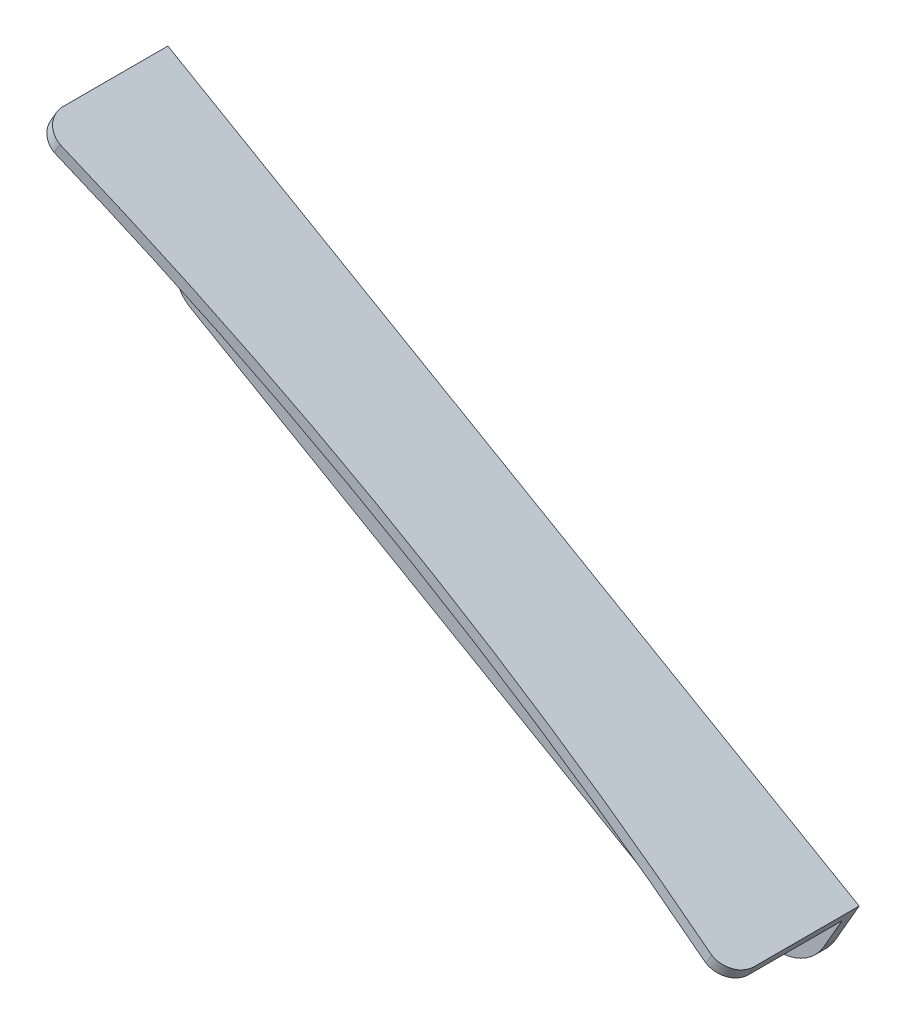
ISO-10303-21;
HEADER;
FILE_DESCRIPTION(('STEP AP214'),'2;1');
FILE_NAME('part.step','',(''),(''),'','','');
FILE_SCHEMA(('AUTOMOTIVE_DESIGN { 1 0 10303 214 1 1 1 1 }'));
ENDSEC;
DATA;
#1=APPLICATION_CONTEXT('core data for automotive mechanical design processes');
#2=APPLICATION_PROTOCOL_DEFINITION('international standard','automotive_design',2000,#1);
#3=PRODUCT_CONTEXT('',#1,'mechanical');
#4=PRODUCT('Part','Part','',(#3));
#5=PRODUCT_RELATED_PRODUCT_CATEGORY('part','',(#4));
#6=PRODUCT_DEFINITION_FORMATION('','',#4);
#7=PRODUCT_DEFINITION_CONTEXT('part definition',#1,'design');
#8=PRODUCT_DEFINITION('design','',#6,#7);
#9=PRODUCT_DEFINITION_SHAPE('','',#8);
#10=(LENGTH_UNIT() NAMED_UNIT(*) SI_UNIT(.MILLI.,.METRE.));
#11=(NAMED_UNIT(*) PLANE_ANGLE_UNIT() SI_UNIT($,.RADIAN.));
#12=(NAMED_UNIT(*) SI_UNIT($,.STERADIAN.) SOLID_ANGLE_UNIT());
#13=UNCERTAINTY_MEASURE_WITH_UNIT(LENGTH_MEASURE(1.E-05),#10,'distance_accuracy_value','');
#14=(GEOMETRIC_REPRESENTATION_CONTEXT(3) GLOBAL_UNCERTAINTY_ASSIGNED_CONTEXT((#13)) GLOBAL_UNIT_ASSIGNED_CONTEXT((#10,
#11,#12)) REPRESENTATION_CONTEXT('',''));
#15=CARTESIAN_POINT('',(0.,0.,0.));
#16=DIRECTION('',(0.,0.,1.));
#17=DIRECTION('',(1.,0.,0.));
#18=AXIS2_PLACEMENT_3D('',#15,#16,#17);
#19=CARTESIAN_POINT('',(19.620752939166,-11.3283792951308,14.224));
#20=DIRECTION('',(0.866019052628733,-0.500011000363024,0.));
#21=DIRECTION('',(0.500011000363024,0.866019052628733,0.));
#22=AXIS2_PLACEMENT_3D('',#19,#20,#21);
#23=PLANE('',#22);
#24=DIRECTION('',(0.,0.,-1.));
#25=VECTOR('',#24,1.);
#26=CARTESIAN_POINT('',(29.5130283607604,5.80504173507003,14.224));
#27=LINE('',#26,#25);
#28=CARTESIAN_POINT('',(29.5130283607604,5.80504173507003,1.27));
#29=VERTEX_POINT('',#28);
#30=CARTESIAN_POINT('',(29.5130283607604,5.80504173507003,0.));
#31=VERTEX_POINT('',#30);
#32=EDGE_CURVE('E28',#29,#31,#27,.T.);
#33=ORIENTED_EDGE('',*,*,#32,.F.);
#34=DIRECTION('',(0.500011000363024,0.866019052628733,0.));
#35=VECTOR('',#34,1.);
#36=CARTESIAN_POINT('',(19.620752939166,-11.3283792951308,1.27));
#37=LINE('',#36,#35);
#38=CARTESIAN_POINT('',(30.5070787253845,7.52673696659909,1.27));
#39=VERTEX_POINT('',#38);
#40=EDGE_CURVE('E316',#29,#39,#37,.T.);
#41=ORIENTED_EDGE('',*,*,#40,.T.);
#42=DIRECTION('',(0.,0.,-1.));
#43=VECTOR('',#42,1.);
#44=CARTESIAN_POINT('',(30.5070787253845,7.52673696659909,14.224));
#45=LINE('',#44,#43);
#46=CARTESIAN_POINT('',(30.5070787253845,7.52673696659909,0.));
#47=VERTEX_POINT('',#46);
#48=EDGE_CURVE('E44',#39,#47,#45,.T.);
#49=ORIENTED_EDGE('',*,*,#48,.T.);
#50=DIRECTION('',(-0.500011000363024,-0.866019052628733,0.));
#51=VECTOR('',#50,1.);
#52=CARTESIAN_POINT('',(19.620752939166,-11.3283792951308,0.));
#53=LINE('',#52,#51);
#54=EDGE_CURVE('E203',#47,#31,#53,.T.);
#55=ORIENTED_EDGE('',*,*,#54,.T.);
#56=EDGE_LOOP('',(#33,#41,#49,#55));
#57=FACE_BOUND('',#56,.T.);
#58=ADVANCED_FACE('F17',(#57),#23,.F.);
#59=CARTESIAN_POINT('',(32.2626388528566,4.21750680891743,14.224));
#60=DIRECTION('',(0.,0.,-1.));
#61=DIRECTION('',(-1.,0.,0.));
#62=AXIS2_PLACEMENT_3D('',#59,#60,#61);
#63=CYLINDRICAL_SURFACE('',#62,3.175);
#64=DIRECTION('',(0.,0.,-1.));
#65=VECTOR('',#64,1.);
#66=CARTESIAN_POINT('',(30.675103926704,1.46789631682121,14.224));
#67=LINE('',#66,#65);
#68=CARTESIAN_POINT('',(30.675103926704,1.4678963168212,1.27));
#69=VERTEX_POINT('',#68);
#70=CARTESIAN_POINT('',(30.675103926704,1.46789631682121,0.));
#71=VERTEX_POINT('',#70);
#72=EDGE_CURVE('E265',#69,#71,#67,.T.);
#73=ORIENTED_EDGE('',*,*,#72,.F.);
#74=CARTESIAN_POINT('',(32.2626388528566,4.21750680891743,1.27));
#75=DIRECTION('',(0.,0.,-1.));
#76=DIRECTION('',(0.,1.,0.));
#77=AXIS2_PLACEMENT_3D('',#74,#75,#76);
#78=CIRCLE('',#77,3.175);
#79=EDGE_CURVE('E321',#69,#29,#78,.T.);
#80=ORIENTED_EDGE('',*,*,#79,.T.);
#81=ORIENTED_EDGE('',*,*,#32,.T.);
#82=CARTESIAN_POINT('',(32.2626388528566,4.21750680891743,0.));
#83=DIRECTION('',(0.,0.,1.));
#84=DIRECTION('',(1.,0.,0.));
#85=AXIS2_PLACEMENT_3D('',#82,#83,#84);
#86=CIRCLE('',#85,3.175);
#87=EDGE_CURVE('E205',#31,#71,#86,.T.);
#88=ORIENTED_EDGE('',*,*,#87,.T.);
#89=EDGE_LOOP('',(#73,#80,#81,#88));
#90=FACE_BOUND('',#89,.T.);
#91=ADVANCED_FACE('F306',(#90),#63,.T.);
#92=CARTESIAN_POINT('',(8.3047404954416,14.3838105381046,14.224));
#93=DIRECTION('',(0.50001100036302,0.866019052628735,0.));
#94=DIRECTION('',(-0.866019052628735,0.50001100036302,0.));
#95=AXIS2_PLACEMENT_3D('',#92,#93,#94);
#96=PLANE('',#95);
#97=DIRECTION('',(0.,0.,-1.));
#98=VECTOR('',#97,1.);
#99=CARTESIAN_POINT('',(82.3672488476662,-28.3774529447048,14.224));
#100=LINE('',#99,#98);
#101=CARTESIAN_POINT('',(82.3672488476662,-28.3774529447048,1.27));
#102=VERTEX_POINT('',#101);
#103=CARTESIAN_POINT('',(82.3672488476662,-28.3774529447048,0.));
#104=VERTEX_POINT('',#103);
#105=EDGE_CURVE('E263',#102,#104,#100,.T.);
#106=ORIENTED_EDGE('',*,*,#105,.F.);
#107=DIRECTION('',(-0.866019052628735,0.50001100036302,0.));
#108=VECTOR('',#107,1.);
#109=CARTESIAN_POINT('',(8.3047404954416,14.3838105381046,1.27));
#110=LINE('',#109,#108);
#111=EDGE_CURVE('E328',#102,#69,#110,.T.);
#112=ORIENTED_EDGE('',*,*,#111,.T.);
#113=ORIENTED_EDGE('',*,*,#72,.T.);
#114=DIRECTION('',(0.866019052628735,-0.50001100036302,0.));
#115=VECTOR('',#114,1.);
#116=CARTESIAN_POINT('',(8.3047404954416,14.3838105381046,0.));
#117=LINE('',#116,#115);
#118=EDGE_CURVE('E208',#71,#104,#117,.T.);
#119=ORIENTED_EDGE('',*,*,#118,.T.);
#120=EDGE_LOOP('',(#106,#112,#113,#119));
#121=FACE_BOUND('',#120,.T.);
#122=ADVANCED_FACE('F302',(#121),#96,.F.);
#123=CARTESIAN_POINT('',(83.9547837738187,-25.6278424526086,14.224));
#124=DIRECTION('',(0.,0.,-1.));
#125=DIRECTION('',(-1.,0.,0.));
#126=AXIS2_PLACEMENT_3D('',#123,#124,#125);
#127=CYLINDRICAL_SURFACE('',#126,3.175);
#128=CARTESIAN_POINT('',(83.9547837738187,-25.6278424526086,1.27));
#129=DIRECTION('',(0.,0.,-1.));
#130=DIRECTION('',(0.,1.,0.));
#131=AXIS2_PLACEMENT_3D('',#128,#129,#130);
#132=CIRCLE('',#131,3.175);
#133=CARTESIAN_POINT('',(86.704394265915,-27.2153773787612,1.27));
#134=VERTEX_POINT('',#133);
#135=EDGE_CURVE('E330',#102,#134,#132,.F.);
#136=ORIENTED_EDGE('',*,*,#135,.F.);
#137=ORIENTED_EDGE('',*,*,#105,.T.);
#138=CARTESIAN_POINT('',(83.9547837738187,-25.6278424526086,0.));
#139=DIRECTION('',(0.,0.,1.));
#140=DIRECTION('',(1.,0.,0.));
#141=AXIS2_PLACEMENT_3D('',#138,#139,#140);
#142=CIRCLE('',#141,3.175);
#143=CARTESIAN_POINT('',(86.704394265915,-27.2153773787612,0.));
#144=VERTEX_POINT('',#143);
#145=EDGE_CURVE('E211',#144,#104,#142,.F.);
#146=ORIENTED_EDGE('',*,*,#145,.F.);
#147=DIRECTION('',(0.,0.,-1.));
#148=VECTOR('',#147,1.);
#149=CARTESIAN_POINT('',(86.704394265915,-27.2153773787612,14.224));
#150=LINE('',#149,#148);
#151=EDGE_CURVE('E261',#134,#144,#150,.T.);
#152=ORIENTED_EDGE('',*,*,#151,.F.);
#153=EDGE_LOOP('',(#136,#137,#146,#152));
#154=FACE_BOUND('',#153,.T.);
#155=ADVANCED_FACE('F298',(#154),#127,.T.);
#156=CARTESIAN_POINT('',(76.8121188443214,-44.3487984089614,14.224));
#157=DIRECTION('',(0.86601905262874,-0.500011000363012,0.));
#158=DIRECTION('',(0.500011000363012,0.86601905262874,0.));
#159=AXIS2_PLACEMENT_3D('',#156,#157,#158);
#160=PLANE('',#159);
#161=DIRECTION('',(0.500011000363012,0.86601905262874,0.));
#162=VECTOR('',#161,1.);
#163=CARTESIAN_POINT('',(76.8121188443214,-44.3487984089614,1.27));
#164=LINE('',#163,#162);
#165=CARTESIAN_POINT('',(87.6984446305392,-25.4936821472321,1.27));
#166=VERTEX_POINT('',#165);
#167=EDGE_CURVE('E332',#134,#166,#164,.T.);
#168=ORIENTED_EDGE('',*,*,#167,.F.);
#169=ORIENTED_EDGE('',*,*,#151,.T.);
#170=DIRECTION('',(-0.500011000363012,-0.86601905262874,0.));
#171=VECTOR('',#170,1.);
#172=CARTESIAN_POINT('',(76.8121188443214,-44.3487984089614,0.));
#173=LINE('',#172,#171);
#174=CARTESIAN_POINT('',(87.6984446305392,-25.4936821472321,0.));
#175=VERTEX_POINT('',#174);
#176=EDGE_CURVE('E214',#175,#144,#173,.T.);
#177=ORIENTED_EDGE('',*,*,#176,.F.);
#178=DIRECTION('',(0.,0.,-1.));
#179=VECTOR('',#178,1.);
#180=CARTESIAN_POINT('',(87.6984446305392,-25.4936821472321,14.224));
#181=LINE('',#180,#179);
#182=EDGE_CURVE('E259',#166,#175,#181,.T.);
#183=ORIENTED_EDGE('',*,*,#182,.F.);
#184=EDGE_LOOP('',(#168,#169,#177,#183));
#185=FACE_BOUND('',#184,.T.);
#186=ADVANCED_FACE('F294',(#185),#160,.T.);
#187=CARTESIAN_POINT('',(88.7982888273777,-26.1286961176931,14.224));
#188=DIRECTION('',(0.,0.,-1.));
#189=DIRECTION('',(-1.,0.,0.));
#190=AXIS2_PLACEMENT_3D('',#187,#188,#189);
#191=CYLINDRICAL_SURFACE('',#190,1.27);
#192=DIRECTION('',(0.,0.,-1.));
#193=VECTOR('',#192,1.);
#194=CARTESIAN_POINT('',(89.4333027978387,-25.0288519208547,14.224));
#195=LINE('',#194,#193);
#196=CARTESIAN_POINT('',(89.4333027978387,-25.0288519208547,1.27));
#197=VERTEX_POINT('',#196);
#198=CARTESIAN_POINT('',(89.4333027978387,-25.0288519208547,0.));
#199=VERTEX_POINT('',#198);
#200=EDGE_CURVE('E257',#197,#199,#195,.T.);
#201=ORIENTED_EDGE('',*,*,#200,.F.);
#202=CARTESIAN_POINT('',(88.7982888273777,-26.1286961176931,1.27));
#203=DIRECTION('',(0.,0.,-1.));
#204=DIRECTION('',(0.,1.,0.));
#205=AXIS2_PLACEMENT_3D('',#202,#203,#204);
#206=CIRCLE('',#205,1.27);
#207=EDGE_CURVE('E338',#197,#166,#206,.F.);
#208=ORIENTED_EDGE('',*,*,#207,.T.);
#209=ORIENTED_EDGE('',*,*,#182,.T.);
#210=CARTESIAN_POINT('',(88.7982888273777,-26.1286961176931,0.));
#211=DIRECTION('',(0.,0.,1.));
#212=DIRECTION('',(1.,0.,0.));
#213=AXIS2_PLACEMENT_3D('',#210,#211,#212);
#214=CIRCLE('',#213,1.27);
#215=EDGE_CURVE('E217',#175,#199,#214,.F.);
#216=ORIENTED_EDGE('',*,*,#215,.T.);
#217=EDGE_LOOP('',(#201,#208,#209,#216));
#218=FACE_BOUND('',#217,.T.);
#219=ADVANCED_FACE('F290',(#218),#191,.F.);
#220=CARTESIAN_POINT('',(11.5213397566799,19.9549604585689,14.224));
#221=DIRECTION('',(-0.500011000363026,-0.866019052628732,0.));
#222=DIRECTION('',(0.866019052628732,-0.500011000363026,0.));
#223=AXIS2_PLACEMENT_3D('',#220,#221,#222);
#224=PLANE('',#223);
#225=DIRECTION('',(0.866019052628732,-0.500011000363026,0.));
#226=VECTOR('',#225,1.);
#227=CARTESIAN_POINT('',(11.5213397566799,19.9549604585689,1.27));
#228=LINE('',#227,#226);
#229=CARTESIAN_POINT('',(93.1192348515182,-27.156988210508,1.27));
#230=VERTEX_POINT('',#229);
#231=EDGE_CURVE('E341',#197,#230,#228,.T.);
#232=ORIENTED_EDGE('',*,*,#231,.F.);
#233=ORIENTED_EDGE('',*,*,#200,.T.);
#234=DIRECTION('',(-0.866019052628732,0.500011000363026,0.));
#235=VECTOR('',#234,1.);
#236=CARTESIAN_POINT('',(11.5213397566799,19.9549604585689,0.));
#237=LINE('',#236,#235);
#238=CARTESIAN_POINT('',(93.1192348515182,-27.156988210508,0.));
#239=VERTEX_POINT('',#238);
#240=EDGE_CURVE('E220',#239,#199,#237,.T.);
#241=ORIENTED_EDGE('',*,*,#240,.F.);
#242=DIRECTION('',(0.,0.,-1.));
#243=VECTOR('',#242,1.);
#244=CARTESIAN_POINT('',(93.1192348515182,-27.156988210508,14.224));
#245=LINE('',#244,#243);
#246=EDGE_CURVE('E254',#230,#239,#245,.T.);
#247=ORIENTED_EDGE('',*,*,#246,.F.);
#248=EDGE_LOOP('',(#232,#233,#241,#247));
#249=FACE_BOUND('',#248,.T.);
#250=ADVANCED_FACE('F286',(#249),#224,.T.);
#251=CARTESIAN_POINT('',(96.0380154823617,-21.9211930474967,14.224));
#252=DIRECTION('',(0.,0.,-1.));
#253=DIRECTION('',(-1.,0.,0.));
#254=AXIS2_PLACEMENT_3D('',#251,#252,#253);
#255=CYLINDRICAL_SURFACE('',#254,5.9944);
#256=CARTESIAN_POINT('',(96.0380154823617,-21.9211930474967,1.27));
#257=DIRECTION('',(0.,0.,-1.));
#258=DIRECTION('',(0.,1.,0.));
#259=AXIS2_PLACEMENT_3D('',#256,#257,#258);
#260=CIRCLE('',#259,5.9944);
#261=CARTESIAN_POINT('',(101.229613167688,-24.9178820259721,1.27));
#262=VERTEX_POINT('',#261);
#263=EDGE_CURVE('E158',#230,#262,#260,.F.);
#264=ORIENTED_EDGE('',*,*,#263,.F.);
#265=ORIENTED_EDGE('',*,*,#246,.T.);
#266=CARTESIAN_POINT('',(96.0380154823617,-21.9211930474967,0.));
#267=DIRECTION('',(0.,0.,1.));
#268=DIRECTION('',(1.,0.,0.));
#269=AXIS2_PLACEMENT_3D('',#266,#267,#268);
#270=CIRCLE('',#269,5.9944);
#271=CARTESIAN_POINT('',(101.229613167688,-24.917882025972,0.));
#272=VERTEX_POINT('',#271);
#273=EDGE_CURVE('E223',#272,#239,#270,.F.);
#274=ORIENTED_EDGE('',*,*,#273,.F.);
#275=DIRECTION('',(0.,0.,-1.));
#276=VECTOR('',#275,1.);
#277=CARTESIAN_POINT('',(101.229613167688,-24.917882025972,14.224));
#278=LINE('',#277,#276);
#279=EDGE_CURVE('E252',#262,#272,#278,.T.);
#280=ORIENTED_EDGE('',*,*,#279,.F.);
#281=EDGE_LOOP('',(#264,#265,#274,#280));
#282=FACE_BOUND('',#281,.T.);
#283=ADVANCED_FACE('F283',(#282),#255,.T.);
#284=CARTESIAN_POINT('',(86.7193717602908,-50.0560716229767,14.224));
#285=DIRECTION('',(0.866074617197085,-0.499914750179391,0.));
#286=DIRECTION('',(0.499914750179391,0.866074617197085,0.));
#287=AXIS2_PLACEMENT_3D('',#284,#285,#286);
#288=PLANE('',#287);
#289=DIRECTION('',(0.49991475017939,0.866074617197085,0.));
#290=VECTOR('',#289,1.);
#291=CARTESIAN_POINT('',(101.229613167688,-24.9178820259721,1.27));
#292=LINE('',#291,#290);
#293=CARTESIAN_POINT('',(103.270347607036,-21.3824226346953,1.27));
#294=VERTEX_POINT('',#293);
#295=EDGE_CURVE('E153',#262,#294,#292,.T.);
#296=ORIENTED_EDGE('',*,*,#295,.F.);
#297=ORIENTED_EDGE('',*,*,#279,.T.);
#298=DIRECTION('',(-0.499914750179391,-0.866074617197085,0.));
#299=VECTOR('',#298,1.);
#300=CARTESIAN_POINT('',(86.7193717602908,-50.0560716229767,0.));
#301=LINE('',#300,#299);
#302=CARTESIAN_POINT('',(103.905239339762,-20.2825078708576,0.));
#303=VERTEX_POINT('',#302);
#304=EDGE_CURVE('E226',#303,#272,#301,.T.);
#305=ORIENTED_EDGE('',*,*,#304,.F.);
#306=DIRECTION('',(0.,0.,-1.));
#307=VECTOR('',#306,1.);
#308=CARTESIAN_POINT('',(103.905239339762,-20.2825078708576,14.224));
#309=LINE('',#308,#307);
#310=CARTESIAN_POINT('',(103.905239316143,-20.2825078572203,11.6839999980184));
#311=VERTEX_POINT('',#310);
#312=EDGE_CURVE('E255',#311,#303,#309,.T.);
#313=ORIENTED_EDGE('',*,*,#312,.F.);
#314=CARTESIAN_POINT('',(103.27022534176,-21.3823520608512,11.6839999980184));
#315=DIRECTION('',(0.500011000363027,0.866019052628731,0.));
#316=VECTOR('',#315,1.);
#317=LINE('',#314,#316);
#318=CARTESIAN_POINT('',(103.270286474398,-21.3823873477732,11.6839999980184));
#319=VERTEX_POINT('',#318);
#320=EDGE_CURVE('E164',#319,#311,#317,.T.);
#321=ORIENTED_EDGE('',*,*,#320,.F.);
#322=DIRECTION('',(0.,0.,1.));
#323=VECTOR('',#322,1.);
#324=CARTESIAN_POINT('',(103.270347607036,-21.3824226346953,18.1978486441535));
#325=LINE('',#324,#323);
#326=EDGE_CURVE('E36',#294,#319,#325,.T.);
#327=ORIENTED_EDGE('',*,*,#326,.F.);
#328=EDGE_LOOP('',(#296,#297,#305,#313,#321,#327));
#329=FACE_BOUND('',#328,.T.);
#330=ADVANCED_FACE('F162',(#329),#288,.T.);
#331=CARTESIAN_POINT('',(17.1947404954417,29.7812905381045,14.224));
#332=DIRECTION('',(0.50001100036302,0.866019052628735,0.));
#333=DIRECTION('',(-0.866019052628735,0.50001100036302,0.));
#334=AXIS2_PLACEMENT_3D('',#331,#332,#333);
#335=PLANE('',#334);
#336=CARTESIAN_POINT('',(29.1168018282849,22.8978833020517,11.684));
#337=DIRECTION('',(0.50001100036302,0.866019052628735,0.));
#338=DIRECTION('',(-0.866019052628735,0.50001100036302,0.));
#339=AXIS2_PLACEMENT_3D('',#336,#337,#338);
#340=CIRCLE('',#339,2.5399999999984);
#341=CARTESIAN_POINT('',(29.1168018282847,22.8978833020518,14.2239999999983));
#342=VERTEX_POINT('',#341);
#343=CARTESIAN_POINT('',(26.9171134739162,24.1679113110438,11.6839999975095));
#344=VERTEX_POINT('',#343);
#345=EDGE_CURVE('E199',#342,#344,#340,.F.);
#346=ORIENTED_EDGE('',*,*,#345,.F.);
#347=CARTESIAN_POINT('',(65.4111763828094,1.94270168858452,427.661582164992));
#348=DIRECTION('',(0.50001100036302,0.866019052628735,0.));
#349=DIRECTION('',(-0.866019052628735,0.50001100036302,0.));
#350=AXIS2_PLACEMENT_3D('',#347,#348,#349);
#351=CIRCLE('',#350,415.556296555825);
#352=CARTESIAN_POINT('',(101.705550941709,-19.0124799274089,14.2240000005105));
#353=VERTEX_POINT('',#352);
#354=EDGE_CURVE('E196',#353,#342,#351,.T.);
#355=ORIENTED_EDGE('',*,*,#354,.F.);
#356=CARTESIAN_POINT('',(101.705550920309,-19.012479915053,11.6839999980184));
#357=DIRECTION('',(0.50001100036302,0.866019052628735,0.));
#358=DIRECTION('',(-0.866019052628735,0.50001100036302,0.));
#359=AXIS2_PLACEMENT_3D('',#356,#357,#358);
#360=CIRCLE('',#359,2.54000000249049);
#361=EDGE_CURVE('E192',#311,#353,#360,.F.);
#362=ORIENTED_EDGE('',*,*,#361,.F.);
#363=ORIENTED_EDGE('',*,*,#312,.T.);
#364=DIRECTION('',(0.866019052628735,-0.50001100036302,0.));
#365=VECTOR('',#364,1.);
#366=CARTESIAN_POINT('',(17.1947404954417,29.7812905381045,0.));
#367=LINE('',#366,#365);
#368=CARTESIAN_POINT('',(26.9171134346079,24.1679112429738,0.));
#369=VERTEX_POINT('',#368);
#370=EDGE_CURVE('E229',#369,#303,#367,.T.);
#371=ORIENTED_EDGE('',*,*,#370,.F.);
#372=DIRECTION('',(0.,0.,-1.));
#373=VECTOR('',#372,1.);
#374=CARTESIAN_POINT('',(26.9171134346079,24.1679112429738,14.224));
#375=LINE('',#374,#373);
#376=EDGE_CURVE('E251',#344,#369,#375,.T.);
#377=ORIENTED_EDGE('',*,*,#376,.F.);
#378=EDGE_LOOP('',(#346,#355,#362,#363,#371,#377));
#379=FACE_BOUND('',#378,.T.);
#380=ADVANCED_FACE('F282',(#379),#335,.T.);
#381=CARTESIAN_POINT('',(9.71843936032239,-5.61254839854365,14.224));
#382=DIRECTION('',(0.865963477363734,-0.500107244370755,0.));
#383=DIRECTION('',(0.500107244370755,0.865963477363734,0.));
#384=AXIS2_PLACEMENT_3D('',#381,#382,#383);
#385=PLANE('',#384);
#386=DIRECTION('',(0.,0.,-1.));
#387=VECTOR('',#386,1.);
#388=CARTESIAN_POINT('',(24.2404570018814,19.5331319265729,14.224));
#389=LINE('',#388,#387);
#390=CARTESIAN_POINT('',(24.2404570018814,19.5331319265729,1.27));
#391=VERTEX_POINT('',#390);
#392=CARTESIAN_POINT('',(24.2404570018814,19.5331319265729,0.));
#393=VERTEX_POINT('',#392);
#394=EDGE_CURVE('E249',#391,#393,#389,.T.);
#395=ORIENTED_EDGE('',*,*,#394,.F.);
#396=DIRECTION('',(0.500107244370755,0.865963477363734,0.));
#397=VECTOR('',#396,1.);
#398=CARTESIAN_POINT('',(9.71843936032239,-5.61254839854364,1.27));
#399=LINE('',#398,#397);
#400=CARTESIAN_POINT('',(26.2770361640701,23.0595818891892,1.27));
#401=VERTEX_POINT('',#400);
#402=EDGE_CURVE('E542',#391,#401,#399,.T.);
#403=ORIENTED_EDGE('',*,*,#402,.T.);
#404=DIRECTION('',(0.,0.,1.));
#405=VECTOR('',#404,1.);
#406=CARTESIAN_POINT('',(26.2770361640701,23.0595818891892,14.224));
#407=LINE('',#406,#405);
#408=CARTESIAN_POINT('',(26.2770977603911,23.0595463346205,11.6839999975095));
#409=VERTEX_POINT('',#408);
#410=EDGE_CURVE('E149',#401,#409,#407,.T.);
#411=ORIENTED_EDGE('',*,*,#410,.T.);
#412=CARTESIAN_POINT('',(26.2770361640701,23.0595818891892,11.6839999975095));
#413=DIRECTION('',(0.500107244370754,0.865963477363735,0.));
#414=VECTOR('',#413,1.);
#415=LINE('',#412,#414);
#416=EDGE_CURVE('E195',#409,#344,#415,.T.);
#417=ORIENTED_EDGE('',*,*,#416,.T.);
#418=ORIENTED_EDGE('',*,*,#376,.T.);
#419=DIRECTION('',(-0.500107244370755,-0.865963477363734,0.));
#420=VECTOR('',#419,1.);
#421=CARTESIAN_POINT('',(9.71843936032239,-5.61254839854365,0.));
#422=LINE('',#421,#420);
#423=EDGE_CURVE('E232',#369,#393,#422,.T.);
#424=ORIENTED_EDGE('',*,*,#423,.T.);
#425=EDGE_LOOP('',(#395,#403,#411,#417,#418,#424));
#426=FACE_BOUND('',#425,.T.);
#427=ADVANCED_FACE('F349',(#426),#385,.F.);
#428=CARTESIAN_POINT('',(29.4313884705906,16.5352890609169,14.224));
#429=DIRECTION('',(0.,0.,-1.));
#430=DIRECTION('',(-1.,0.,0.));
#431=AXIS2_PLACEMENT_3D('',#428,#429,#430);
#432=CYLINDRICAL_SURFACE('',#431,5.9944);
#433=DIRECTION('',(0.,0.,-1.));
#434=VECTOR('',#433,1.);
#435=CARTESIAN_POINT('',(26.3563164453276,11.3897314235519,14.224));
#436=LINE('',#435,#434);
#437=CARTESIAN_POINT('',(26.3563164453276,11.3897314235519,1.27));
#438=VERTEX_POINT('',#437);
#439=CARTESIAN_POINT('',(26.3563164453276,11.3897314235519,0.));
#440=VERTEX_POINT('',#439);
#441=EDGE_CURVE('E247',#438,#440,#436,.T.);
#442=ORIENTED_EDGE('',*,*,#441,.F.);
#443=CARTESIAN_POINT('',(29.4313884705906,16.5352890609169,1.27));
#444=DIRECTION('',(0.,0.,-1.));
#445=DIRECTION('',(0.,1.,0.));
#446=AXIS2_PLACEMENT_3D('',#443,#444,#445);
#447=CIRCLE('',#446,5.9944);
#448=EDGE_CURVE('E545',#438,#391,#447,.T.);
#449=ORIENTED_EDGE('',*,*,#448,.T.);
#450=ORIENTED_EDGE('',*,*,#394,.T.);
#451=CARTESIAN_POINT('',(29.4313884705906,16.5352890609169,0.));
#452=DIRECTION('',(0.,0.,1.));
#453=DIRECTION('',(1.,0.,0.));
#454=AXIS2_PLACEMENT_3D('',#451,#452,#453);
#455=CIRCLE('',#454,5.9944);
#456=EDGE_CURVE('E235',#393,#440,#455,.T.);
#457=ORIENTED_EDGE('',*,*,#456,.T.);
#458=EDGE_LOOP('',(#442,#449,#450,#457));
#459=FACE_BOUND('',#458,.T.);
#460=ADVANCED_FACE('F395',(#459),#432,.T.);
#461=CARTESIAN_POINT('',(11.5213397566793,19.9549604585684,14.224));
#462=DIRECTION('',(0.500011000363016,0.866019052628737,0.));
#463=DIRECTION('',(-0.866019052628738,0.500011000363016,0.));
#464=AXIS2_PLACEMENT_3D('',#461,#462,#463);
#465=PLANE('',#464);
#466=DIRECTION('',(0.,0.,-1.));
#467=VECTOR('',#466,1.);
#468=CARTESIAN_POINT('',(30.0422484990071,9.26159513389862,14.224));
#469=LINE('',#468,#467);
#470=CARTESIAN_POINT('',(30.0422484990071,9.26159513389862,1.27));
#471=VERTEX_POINT('',#470);
#472=CARTESIAN_POINT('',(30.0422484990071,9.26159513389862,0.));
#473=VERTEX_POINT('',#472);
#474=EDGE_CURVE('E245',#471,#473,#469,.T.);
#475=ORIENTED_EDGE('',*,*,#474,.F.);
#476=DIRECTION('',(-0.866019052628738,0.500011000363016,0.));
#477=VECTOR('',#476,1.);
#478=CARTESIAN_POINT('',(11.5213397566793,19.9549604585684,1.27));
#479=LINE('',#478,#477);
#480=EDGE_CURVE('E189',#471,#438,#479,.T.);
#481=ORIENTED_EDGE('',*,*,#480,.T.);
#482=ORIENTED_EDGE('',*,*,#441,.T.);
#483=DIRECTION('',(0.866019052628738,-0.500011000363016,0.));
#484=VECTOR('',#483,1.);
#485=CARTESIAN_POINT('',(11.5213397566793,19.9549604585684,0.));
#486=LINE('',#485,#484);
#487=EDGE_CURVE('E238',#440,#473,#486,.T.);
#488=ORIENTED_EDGE('',*,*,#487,.T.);
#489=EDGE_LOOP('',(#475,#481,#482,#488));
#490=FACE_BOUND('',#489,.T.);
#491=ADVANCED_FACE('F392',(#490),#465,.F.);
#492=CARTESIAN_POINT('',(60.9661763871851,-5.75603831394187,14.224));
#493=DIRECTION('',(0.,0.,-1.));
#494=DIRECTION('',(-1.,0.,0.));
#495=AXIS2_PLACEMENT_3D('',#492,#493,#494);
#496=CYLINDRICAL_SURFACE('',#495,1.5875);
#497=CARTESIAN_POINT('',(60.9661763871851,-5.75603831394187,1.27));
#498=DIRECTION('',(0.,0.,-1.));
#499=DIRECTION('',(0.,1.,0.));
#500=AXIS2_PLACEMENT_3D('',#497,#498,#499);
#501=CIRCLE('',#500,1.5875);
#502=CARTESIAN_POINT('',(60.9661763871851,-4.16853831394187,1.27));
#503=VERTEX_POINT('',#502);
#504=EDGE_CURVE('E171',#503,#503,#501,.T.);
#505=ORIENTED_EDGE('',*,*,#504,.F.);
#506=EDGE_LOOP('',(#505));
#507=FACE_BOUND('',#506,.T.);
#508=CARTESIAN_POINT('',(60.9661763871851,-5.75603831394187,0.));
#509=DIRECTION('',(0.,0.,1.));
#510=DIRECTION('',(1.,0.,0.));
#511=AXIS2_PLACEMENT_3D('',#508,#509,#510);
#512=CIRCLE('',#511,1.5875);
#513=CARTESIAN_POINT('',(62.5536763871851,-5.75603831394187,0.));
#514=VERTEX_POINT('',#513);
#515=EDGE_CURVE('E200',#514,#514,#512,.T.);
#516=ORIENTED_EDGE('',*,*,#515,.F.);
#517=EDGE_LOOP('',(#516));
#518=FACE_BOUND('',#517,.T.);
#519=ADVANCED_FACE('F19',(#507,#518),#496,.F.);
#520=CARTESIAN_POINT('',(29.4072345285461,8.16175093706012,14.224));
#521=DIRECTION('',(0.,0.,-1.));
#522=DIRECTION('',(-1.,0.,0.));
#523=AXIS2_PLACEMENT_3D('',#520,#521,#522);
#524=CYLINDRICAL_SURFACE('',#523,1.27);
#525=CARTESIAN_POINT('',(29.4072345285461,8.16175093706012,1.27));
#526=DIRECTION('',(0.,0.,-1.));
#527=DIRECTION('',(0.,1.,0.));
#528=AXIS2_PLACEMENT_3D('',#525,#526,#527);
#529=CIRCLE('',#528,1.27);
#530=EDGE_CURVE('E11',#471,#39,#529,.T.);
#531=ORIENTED_EDGE('',*,*,#530,.F.);
#532=ORIENTED_EDGE('',*,*,#474,.T.);
#533=CARTESIAN_POINT('',(29.4072345285461,8.16175093706012,0.));
#534=DIRECTION('',(0.,0.,1.));
#535=DIRECTION('',(1.,0.,0.));
#536=AXIS2_PLACEMENT_3D('',#533,#534,#535);
#537=CIRCLE('',#536,1.27);
#538=EDGE_CURVE('E241',#47,#473,#537,.T.);
#539=ORIENTED_EDGE('',*,*,#538,.F.);
#540=ORIENTED_EDGE('',*,*,#48,.F.);
#541=EDGE_LOOP('',(#531,#532,#539,#540));
#542=FACE_BOUND('',#541,.T.);
#543=ADVANCED_FACE('F387',(#542),#524,.F.);
#544=CARTESIAN_POINT('',(0.,0.,0.));
#545=DIRECTION('',(0.,0.,1.));
#546=DIRECTION('',(1.,0.,0.));
#547=AXIS2_PLACEMENT_3D('',#544,#545,#546);
#548=PLANE('',#547);
#549=ORIENTED_EDGE('',*,*,#515,.T.);
#550=EDGE_LOOP('',(#549));
#551=FACE_BOUND('',#550,.T.);
#552=ORIENTED_EDGE('',*,*,#54,.F.);
#553=ORIENTED_EDGE('',*,*,#538,.T.);
#554=ORIENTED_EDGE('',*,*,#487,.F.);
#555=ORIENTED_EDGE('',*,*,#456,.F.);
#556=ORIENTED_EDGE('',*,*,#423,.F.);
#557=ORIENTED_EDGE('',*,*,#370,.T.);
#558=ORIENTED_EDGE('',*,*,#304,.T.);
#559=ORIENTED_EDGE('',*,*,#273,.T.);
#560=ORIENTED_EDGE('',*,*,#240,.T.);
#561=ORIENTED_EDGE('',*,*,#215,.F.);
#562=ORIENTED_EDGE('',*,*,#176,.T.);
#563=ORIENTED_EDGE('',*,*,#145,.T.);
#564=ORIENTED_EDGE('',*,*,#118,.F.);
#565=ORIENTED_EDGE('',*,*,#87,.F.);
#566=EDGE_LOOP('',(#552,#553,#554,#555,#556,#557,#558,#559,#560,#561,#562,#563,#564,#565));
#567=FACE_BOUND('',#566,.T.);
#568=ADVANCED_FACE('F323',(#551,#567),#548,.F.);
#569=CARTESIAN_POINT('',(5.30938671082808,-18.336559681383,11.684));
#570=DIRECTION('',(0.500011000363017,0.866019052628737,0.));
#571=DIRECTION('',(-0.866019052628737,0.500011000363017,0.));
#572=AXIS2_PLACEMENT_3D('',#569,#570,#571);
#573=CYLINDRICAL_SURFACE('',#572,2.5399999999984);
#574=ORIENTED_EDGE('',*,*,#416,.F.);
#575=CARTESIAN_POINT('',(28.4769888979755,21.789727306756,11.684));
#576=DIRECTION('',(0.499914750179391,0.866074617197085,0.));
#577=DIRECTION('',(0.866074617197085,-0.499914750179391,0.));
#578=AXIS2_PLACEMENT_3D('',#575,#576,#577);
#579=ELLIPSE('',#578,2.54000001568482,2.5399999999984);
#580=CARTESIAN_POINT('',(28.4769888979753,21.7897273067561,14.2239999999983));
#581=VERTEX_POINT('',#580);
#582=EDGE_CURVE('E181',#409,#581,#579,.T.);
#583=ORIENTED_EDGE('',*,*,#582,.T.);
#584=DIRECTION('',(0.500011000363017,0.866019052628737,0.));
#585=VECTOR('',#584,1.);
#586=CARTESIAN_POINT('',(5.3093867108279,-18.3365596813829,14.2239999999983));
#587=LINE('',#586,#585);
#588=EDGE_CURVE('E190',#581,#342,#587,.T.);
#589=ORIENTED_EDGE('',*,*,#588,.T.);
#590=ORIENTED_EDGE('',*,*,#345,.T.);
#591=EDGE_LOOP('',(#574,#583,#589,#590));
#592=FACE_BOUND('',#591,.T.);
#593=ADVANCED_FACE('F356',(#592),#573,.T.);
#594=CARTESIAN_POINT('',(41.6037612653527,-39.2917412948501,427.661582164992));
#595=DIRECTION('',(0.500011000363017,0.866019052628737,0.));
#596=DIRECTION('',(-0.866019052628737,0.500011000363017,0.));
#597=AXIS2_PLACEMENT_3D('',#594,#595,#596);
#598=CYLINDRICAL_SURFACE('',#597,415.556296555825);
#599=ORIENTED_EDGE('',*,*,#588,.F.);
#600=CARTESIAN_POINT('',(64.7736923566692,0.838579355309774,427.661582164992));
#601=DIRECTION('',(0.499914750179391,0.866074617197085,0.));
#602=DIRECTION('',(0.866074617197085,-0.499914750179391,0.));
#603=AXIS2_PLACEMENT_3D('',#600,#601,#602);
#604=ELLIPSE('',#603,415.556299122202,415.556296555825);
#605=CARTESIAN_POINT('',(101.070395819739,-20.1125685986623,14.2240000005105));
#606=VERTEX_POINT('',#605);
#607=EDGE_CURVE('E178',#581,#606,#604,.F.);
#608=ORIENTED_EDGE('',*,*,#607,.T.);
#609=DIRECTION('',(0.500011000363017,0.866019052628737,0.));
#610=VECTOR('',#609,1.);
#611=CARTESIAN_POINT('',(77.8981358242528,-60.2469229108434,14.2240000005105));
#612=LINE('',#611,#610);
#613=EDGE_CURVE('E193',#606,#353,#612,.T.);
#614=ORIENTED_EDGE('',*,*,#613,.T.);
#615=ORIENTED_EDGE('',*,*,#354,.T.);
#616=EDGE_LOOP('',(#599,#608,#614,#615));
#617=FACE_BOUND('',#616,.T.);
#618=ADVANCED_FACE('F381',(#617),#598,.F.);
#619=CARTESIAN_POINT('',(77.8981358028522,-60.2469228984875,11.6839999980184));
#620=DIRECTION('',(0.500011000363017,0.866019052628737,0.));
#621=DIRECTION('',(-0.866019052628737,0.500011000363017,0.));
#622=AXIS2_PLACEMENT_3D('',#619,#620,#621);
#623=CYLINDRICAL_SURFACE('',#622,2.54000000249049);
#624=ORIENTED_EDGE('',*,*,#613,.F.);
#625=CARTESIAN_POINT('',(101.070395798337,-20.1125685863087,11.6839999980184));
#626=DIRECTION('',(0.499914750179391,0.866074617197085,0.));
#627=DIRECTION('',(0.866074617197085,-0.499914750179391,0.));
#628=AXIS2_PLACEMENT_3D('',#625,#626,#627);
#629=ELLIPSE('',#628,2.54000001817692,2.54000000249049);
#630=EDGE_CURVE('E152',#606,#319,#629,.T.);
#631=ORIENTED_EDGE('',*,*,#630,.T.);
#632=ORIENTED_EDGE('',*,*,#320,.T.);
#633=ORIENTED_EDGE('',*,*,#361,.T.);
#634=EDGE_LOOP('',(#624,#631,#632,#633));
#635=FACE_BOUND('',#634,.T.);
#636=ADVANCED_FACE('F382',(#635),#623,.T.);
#637=CARTESIAN_POINT('',(23.6668921421238,24.5662066888935,18.1978486441535));
#638=DIRECTION('',(0.499914750179391,0.866074617197085,0.));
#639=DIRECTION('',(-0.866074617197085,0.499914750179391,0.));
#640=AXIS2_PLACEMENT_3D('',#637,#638,#639);
#641=PLANE('',#640);
#642=DIRECTION('',(0.866074617197085,-0.499914750179391,0.));
#643=VECTOR('',#642,1.);
#644=CARTESIAN_POINT('',(23.6668921421238,24.5662066888935,1.27));
#645=LINE('',#644,#643);
#646=EDGE_CURVE('E145',#401,#294,#645,.T.);
#647=ORIENTED_EDGE('',*,*,#646,.T.);
#648=ORIENTED_EDGE('',*,*,#326,.T.);
#649=ORIENTED_EDGE('',*,*,#630,.F.);
#650=ORIENTED_EDGE('',*,*,#607,.F.);
#651=ORIENTED_EDGE('',*,*,#582,.F.);
#652=ORIENTED_EDGE('',*,*,#410,.F.);
#653=EDGE_LOOP('',(#647,#648,#649,#650,#651,#652));
#654=FACE_BOUND('',#653,.T.);
#655=ADVANCED_FACE('F147',(#654),#641,.F.);
#656=CARTESIAN_POINT('',(21.6261577027755,21.0307472976167,1.27));
#657=DIRECTION('',(0.,0.,-1.));
#658=DIRECTION('',(0.,1.,0.));
#659=AXIS2_PLACEMENT_3D('',#656,#657,#658);
#660=PLANE('',#659);
#661=ORIENTED_EDGE('',*,*,#504,.T.);
#662=EDGE_LOOP('',(#661));
#663=FACE_BOUND('',#662,.T.);
#664=ORIENTED_EDGE('',*,*,#263,.T.);
#665=ORIENTED_EDGE('',*,*,#295,.T.);
#666=ORIENTED_EDGE('',*,*,#646,.F.);
#667=ORIENTED_EDGE('',*,*,#402,.F.);
#668=ORIENTED_EDGE('',*,*,#448,.F.);
#669=ORIENTED_EDGE('',*,*,#480,.F.);
#670=ORIENTED_EDGE('',*,*,#530,.T.);
#671=ORIENTED_EDGE('',*,*,#40,.F.);
#672=ORIENTED_EDGE('',*,*,#79,.F.);
#673=ORIENTED_EDGE('',*,*,#111,.F.);
#674=ORIENTED_EDGE('',*,*,#135,.T.);
#675=ORIENTED_EDGE('',*,*,#167,.T.);
#676=ORIENTED_EDGE('',*,*,#207,.F.);
#677=ORIENTED_EDGE('',*,*,#231,.T.);
#678=EDGE_LOOP('',(#664,#665,#666,#667,#668,#669,#670,#671,#672,#673,#674,#675,#676,#677));
#679=FACE_BOUND('',#678,.T.);
#680=ADVANCED_FACE('F156',(#663,#679),#660,.F.);
#681=CLOSED_SHELL('',(#58,#91,#122,#155,#186,#219,#250,#283,#330,#380,#427,#460,#491,#519,#543,
#568,#593,#618,#636,#655,#680));
#682=MANIFOLD_SOLID_BREP('B1',#681);
#683=ADVANCED_BREP_SHAPE_REPRESENTATION('',(#18,#682),#14);
#684=SHAPE_DEFINITION_REPRESENTATION(#9,#683);
ENDSEC;
END-ISO-10303-21;
